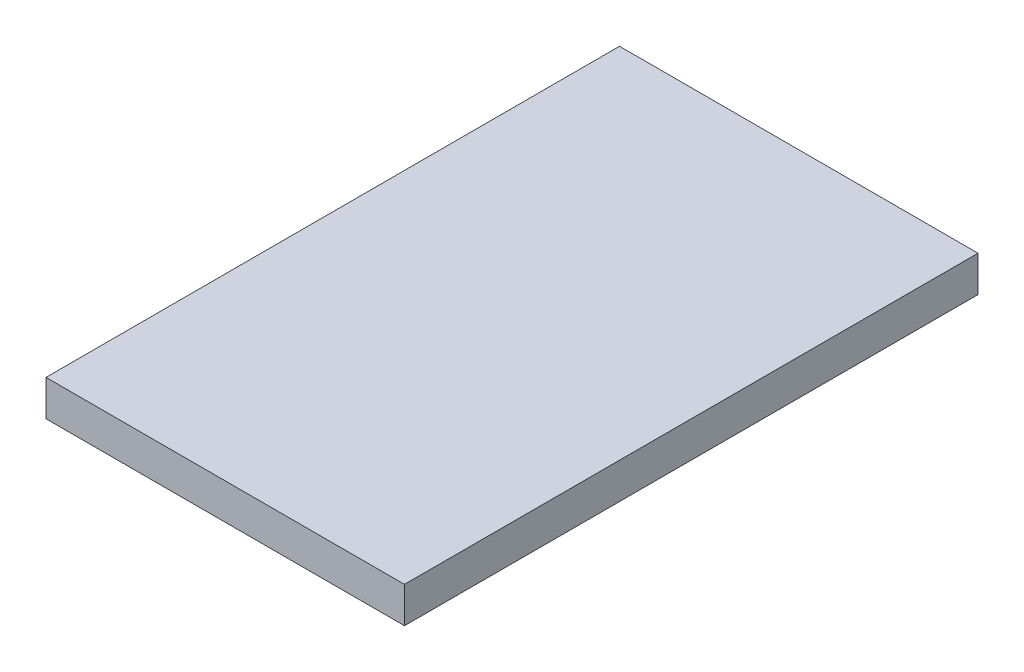
ISO-10303-21;
HEADER;
FILE_DESCRIPTION(('STEP AP214'),'2;1');
FILE_NAME('part.step','',(''),(''),'','','');
FILE_SCHEMA(('AUTOMOTIVE_DESIGN { 1 0 10303 214 1 1 1 1 }'));
ENDSEC;
DATA;
#1=APPLICATION_CONTEXT('core data for automotive mechanical design processes');
#2=APPLICATION_PROTOCOL_DEFINITION('international standard','automotive_design',2000,#1);
#3=PRODUCT_CONTEXT('',#1,'mechanical');
#4=PRODUCT('Part','Part','',(#3));
#5=PRODUCT_RELATED_PRODUCT_CATEGORY('part','',(#4));
#6=PRODUCT_DEFINITION_FORMATION('','',#4);
#7=PRODUCT_DEFINITION_CONTEXT('part definition',#1,'design');
#8=PRODUCT_DEFINITION('design','',#6,#7);
#9=PRODUCT_DEFINITION_SHAPE('','',#8);
#10=(LENGTH_UNIT() NAMED_UNIT(*) SI_UNIT(.MILLI.,.METRE.));
#11=(NAMED_UNIT(*) PLANE_ANGLE_UNIT() SI_UNIT($,.RADIAN.));
#12=(NAMED_UNIT(*) SI_UNIT($,.STERADIAN.) SOLID_ANGLE_UNIT());
#13=UNCERTAINTY_MEASURE_WITH_UNIT(LENGTH_MEASURE(1.E-05),#10,'distance_accuracy_value','');
#14=(GEOMETRIC_REPRESENTATION_CONTEXT(3) GLOBAL_UNCERTAINTY_ASSIGNED_CONTEXT((#13)) GLOBAL_UNIT_ASSIGNED_CONTEXT((#10,
#11,#12)) REPRESENTATION_CONTEXT('',''));
#15=CARTESIAN_POINT('',(0.,0.,0.));
#16=DIRECTION('',(0.,0.,1.));
#17=DIRECTION('',(1.,0.,0.));
#18=AXIS2_PLACEMENT_3D('',#15,#16,#17);
#19=CARTESIAN_POINT('',(0.,0.,80.));
#20=DIRECTION('',(1.,0.,0.));
#21=DIRECTION('',(0.,0.,-1.));
#22=AXIS2_PLACEMENT_3D('',#19,#20,#21);
#23=PLANE('',#22);
#24=DIRECTION('',(0.,-1.,0.));
#25=VECTOR('',#24,1.);
#26=CARTESIAN_POINT('',(0.,0.,0.));
#27=LINE('',#26,#25);
#28=CARTESIAN_POINT('',(0.,5.,0.));
#29=VERTEX_POINT('',#28);
#30=CARTESIAN_POINT('',(0.,0.,0.));
#31=VERTEX_POINT('',#30);
#32=EDGE_CURVE('E99',#29,#31,#27,.T.);
#33=ORIENTED_EDGE('',*,*,#32,.T.);
#34=DIRECTION('',(0.,0.,-1.));
#35=VECTOR('',#34,1.);
#36=CARTESIAN_POINT('',(0.,0.,80.));
#37=LINE('',#36,#35);
#38=CARTESIAN_POINT('',(0.,0.,80.));
#39=VERTEX_POINT('',#38);
#40=EDGE_CURVE('E11',#39,#31,#37,.T.);
#41=ORIENTED_EDGE('',*,*,#40,.F.);
#42=DIRECTION('',(0.,-1.,0.));
#43=VECTOR('',#42,1.);
#44=CARTESIAN_POINT('',(0.,0.,80.));
#45=LINE('',#44,#43);
#46=CARTESIAN_POINT('',(0.,5.,80.));
#47=VERTEX_POINT('',#46);
#48=EDGE_CURVE('E87',#47,#39,#45,.T.);
#49=ORIENTED_EDGE('',*,*,#48,.F.);
#50=DIRECTION('',(0.,0.,-1.));
#51=VECTOR('',#50,1.);
#52=CARTESIAN_POINT('',(0.,5.,80.));
#53=LINE('',#52,#51);
#54=EDGE_CURVE('E95',#47,#29,#53,.T.);
#55=ORIENTED_EDGE('',*,*,#54,.T.);
#56=EDGE_LOOP('',(#33,#41,#49,#55));
#57=FACE_BOUND('',#56,.T.);
#58=ADVANCED_FACE('F36',(#57),#23,.F.);
#59=CARTESIAN_POINT('',(0.,0.,80.));
#60=DIRECTION('',(0.,1.,0.));
#61=DIRECTION('',(0.,0.,1.));
#62=AXIS2_PLACEMENT_3D('',#59,#60,#61);
#63=PLANE('',#62);
#64=DIRECTION('',(1.,0.,0.));
#65=VECTOR('',#64,1.);
#66=CARTESIAN_POINT('',(0.,0.,0.));
#67=LINE('',#66,#65);
#68=CARTESIAN_POINT('',(50.,0.,0.));
#69=VERTEX_POINT('',#68);
#70=EDGE_CURVE('E91',#31,#69,#67,.T.);
#71=ORIENTED_EDGE('',*,*,#70,.T.);
#72=DIRECTION('',(0.,0.,-1.));
#73=VECTOR('',#72,1.);
#74=CARTESIAN_POINT('',(50.,0.,80.));
#75=LINE('',#74,#73);
#76=CARTESIAN_POINT('',(50.,0.,80.));
#77=VERTEX_POINT('',#76);
#78=EDGE_CURVE('E44',#77,#69,#75,.T.);
#79=ORIENTED_EDGE('',*,*,#78,.F.);
#80=DIRECTION('',(1.,0.,0.));
#81=VECTOR('',#80,1.);
#82=CARTESIAN_POINT('',(0.,0.,80.));
#83=LINE('',#82,#81);
#84=EDGE_CURVE('E82',#39,#77,#83,.T.);
#85=ORIENTED_EDGE('',*,*,#84,.F.);
#86=ORIENTED_EDGE('',*,*,#40,.T.);
#87=EDGE_LOOP('',(#71,#79,#85,#86));
#88=FACE_BOUND('',#87,.T.);
#89=ADVANCED_FACE('F90',(#88),#63,.F.);
#90=CARTESIAN_POINT('',(50.,5.,80.));
#91=DIRECTION('',(-1.,0.,0.));
#92=DIRECTION('',(0.,0.,1.));
#93=AXIS2_PLACEMENT_3D('',#90,#91,#92);
#94=PLANE('',#93);
#95=DIRECTION('',(0.,1.,0.));
#96=VECTOR('',#95,1.);
#97=CARTESIAN_POINT('',(50.,5.,0.));
#98=LINE('',#97,#96);
#99=CARTESIAN_POINT('',(50.,5.,0.));
#100=VERTEX_POINT('',#99);
#101=EDGE_CURVE('E69',#69,#100,#98,.T.);
#102=ORIENTED_EDGE('',*,*,#101,.T.);
#103=DIRECTION('',(0.,0.,-1.));
#104=VECTOR('',#103,1.);
#105=CARTESIAN_POINT('',(50.,5.,80.));
#106=LINE('',#105,#104);
#107=CARTESIAN_POINT('',(50.,5.,80.));
#108=VERTEX_POINT('',#107);
#109=EDGE_CURVE('E92',#108,#100,#106,.T.);
#110=ORIENTED_EDGE('',*,*,#109,.F.);
#111=DIRECTION('',(0.,1.,0.));
#112=VECTOR('',#111,1.);
#113=CARTESIAN_POINT('',(50.,5.,80.));
#114=LINE('',#113,#112);
#115=EDGE_CURVE('E85',#77,#108,#114,.T.);
#116=ORIENTED_EDGE('',*,*,#115,.F.);
#117=ORIENTED_EDGE('',*,*,#78,.T.);
#118=EDGE_LOOP('',(#102,#110,#116,#117));
#119=FACE_BOUND('',#118,.T.);
#120=ADVANCED_FACE('F93',(#119),#94,.F.);
#121=CARTESIAN_POINT('',(0.,5.,80.));
#122=DIRECTION('',(0.,-1.,0.));
#123=DIRECTION('',(0.,0.,-1.));
#124=AXIS2_PLACEMENT_3D('',#121,#122,#123);
#125=PLANE('',#124);
#126=DIRECTION('',(-1.,0.,0.));
#127=VECTOR('',#126,1.);
#128=CARTESIAN_POINT('',(0.,5.,0.));
#129=LINE('',#128,#127);
#130=EDGE_CURVE('E75',#100,#29,#129,.T.);
#131=ORIENTED_EDGE('',*,*,#130,.T.);
#132=ORIENTED_EDGE('',*,*,#54,.F.);
#133=DIRECTION('',(-1.,0.,0.));
#134=VECTOR('',#133,1.);
#135=CARTESIAN_POINT('',(0.,5.,80.));
#136=LINE('',#135,#134);
#137=EDGE_CURVE('E52',#108,#47,#136,.T.);
#138=ORIENTED_EDGE('',*,*,#137,.F.);
#139=ORIENTED_EDGE('',*,*,#109,.T.);
#140=EDGE_LOOP('',(#131,#132,#138,#139));
#141=FACE_BOUND('',#140,.T.);
#142=ADVANCED_FACE('F106',(#141),#125,.F.);
#143=CARTESIAN_POINT('',(0.,0.,80.));
#144=DIRECTION('',(0.,0.,-1.));
#145=DIRECTION('',(-1.,0.,0.));
#146=AXIS2_PLACEMENT_3D('',#143,#144,#145);
#147=PLANE('',#146);
#148=ORIENTED_EDGE('',*,*,#48,.T.);
#149=ORIENTED_EDGE('',*,*,#84,.T.);
#150=ORIENTED_EDGE('',*,*,#115,.T.);
#151=ORIENTED_EDGE('',*,*,#137,.T.);
#152=EDGE_LOOP('',(#148,#149,#150,#151));
#153=FACE_BOUND('',#152,.T.);
#154=ADVANCED_FACE('F83',(#153),#147,.F.);
#155=CARTESIAN_POINT('',(0.,0.,0.));
#156=DIRECTION('',(0.,0.,-1.));
#157=DIRECTION('',(-1.,0.,0.));
#158=AXIS2_PLACEMENT_3D('',#155,#156,#157);
#159=PLANE('',#158);
#160=ORIENTED_EDGE('',*,*,#32,.F.);
#161=ORIENTED_EDGE('',*,*,#130,.F.);
#162=ORIENTED_EDGE('',*,*,#101,.F.);
#163=ORIENTED_EDGE('',*,*,#70,.F.);
#164=EDGE_LOOP('',(#160,#161,#162,#163));
#165=FACE_BOUND('',#164,.T.);
#166=ADVANCED_FACE('F109',(#165),#159,.T.);
#167=CLOSED_SHELL('',(#58,#89,#120,#142,#154,#166));
#168=MANIFOLD_SOLID_BREP('B2',#167);
#169=ADVANCED_BREP_SHAPE_REPRESENTATION('',(#18,#168),#14);
#170=SHAPE_DEFINITION_REPRESENTATION(#9,#169);
ENDSEC;
END-ISO-10303-21;
